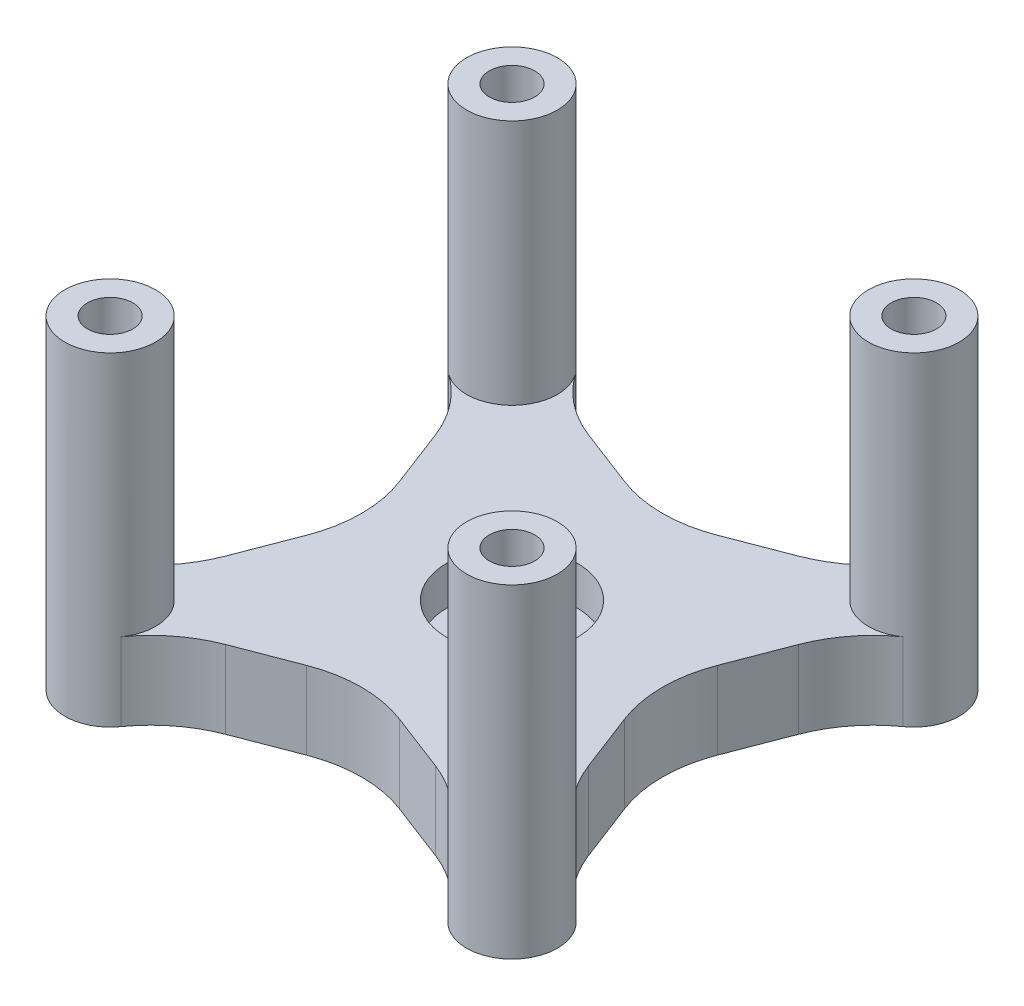
ISO-10303-21;
HEADER;
FILE_DESCRIPTION(('STEP AP214'),'2;1');
FILE_NAME('part.step','',(''),(''),'','','');
FILE_SCHEMA(('AUTOMOTIVE_DESIGN { 1 0 10303 214 1 1 1 1 }'));
ENDSEC;
DATA;
#1=APPLICATION_CONTEXT('core data for automotive mechanical design processes');
#2=APPLICATION_PROTOCOL_DEFINITION('international standard','automotive_design',2000,#1);
#3=PRODUCT_CONTEXT('',#1,'mechanical');
#4=PRODUCT('Part','Part','',(#3));
#5=PRODUCT_RELATED_PRODUCT_CATEGORY('part','',(#4));
#6=PRODUCT_DEFINITION_FORMATION('','',#4);
#7=PRODUCT_DEFINITION_CONTEXT('part definition',#1,'design');
#8=PRODUCT_DEFINITION('design','',#6,#7);
#9=PRODUCT_DEFINITION_SHAPE('','',#8);
#10=(LENGTH_UNIT() NAMED_UNIT(*) SI_UNIT(.MILLI.,.METRE.));
#11=(NAMED_UNIT(*) PLANE_ANGLE_UNIT() SI_UNIT($,.RADIAN.));
#12=(NAMED_UNIT(*) SI_UNIT($,.STERADIAN.) SOLID_ANGLE_UNIT());
#13=UNCERTAINTY_MEASURE_WITH_UNIT(LENGTH_MEASURE(1.E-05),#10,'distance_accuracy_value','');
#14=(GEOMETRIC_REPRESENTATION_CONTEXT(3) GLOBAL_UNCERTAINTY_ASSIGNED_CONTEXT((#13)) GLOBAL_UNIT_ASSIGNED_CONTEXT((#10,
#11,#12)) REPRESENTATION_CONTEXT('',''));
#15=CARTESIAN_POINT('',(0.,0.,0.));
#16=DIRECTION('',(0.,0.,1.));
#17=DIRECTION('',(1.,0.,0.));
#18=AXIS2_PLACEMENT_3D('',#15,#16,#17);
#19=CARTESIAN_POINT('',(-15.5,25.,15.5));
#20=DIRECTION('',(0.,-1.,0.));
#21=DIRECTION('',(0.,0.,-1.));
#22=AXIS2_PLACEMENT_3D('',#19,#20,#21);
#23=CYLINDRICAL_SURFACE('',#22,3.5);
#24=CARTESIAN_POINT('',(-15.5,25.,15.5));
#25=DIRECTION('',(0.,1.,0.));
#26=DIRECTION('',(0.,0.,1.));
#27=AXIS2_PLACEMENT_3D('',#24,#25,#26);
#28=CIRCLE('',#27,3.5);
#29=CARTESIAN_POINT('',(-15.5,25.,19.));
#30=VERTEX_POINT('',#29);
#31=EDGE_CURVE('E263',#30,#30,#28,.T.);
#32=ORIENTED_EDGE('',*,*,#31,.F.);
#33=EDGE_LOOP('',(#32));
#34=FACE_BOUND('',#33,.T.);
#35=CARTESIAN_POINT('',(-15.5,6.,15.5));
#36=DIRECTION('',(0.,1.,0.));
#37=DIRECTION('',(0.,0.,1.));
#38=AXIS2_PLACEMENT_3D('',#35,#36,#37);
#39=CIRCLE('',#38,3.5);
#40=CARTESIAN_POINT('',(-12.6502593340276,6.,17.5319887147086));
#41=VERTEX_POINT('',#40);
#42=CARTESIAN_POINT('',(-17.5319887147086,6.,12.6502593340276));
#43=VERTEX_POINT('',#42);
#44=EDGE_CURVE('E251',#41,#43,#39,.T.);
#45=ORIENTED_EDGE('',*,*,#44,.T.);
#46=DIRECTION('',(0.,-1.,0.));
#47=VECTOR('',#46,1.);
#48=CARTESIAN_POINT('',(-17.5319887147086,25.,12.6502593340276));
#49=LINE('',#48,#47);
#50=CARTESIAN_POINT('',(-17.5319887147086,0.,12.6502593340276));
#51=VERTEX_POINT('',#50);
#52=EDGE_CURVE('E238',#43,#51,#49,.T.);
#53=ORIENTED_EDGE('',*,*,#52,.T.);
#54=CARTESIAN_POINT('',(-15.5,0.,15.5));
#55=DIRECTION('',(0.,1.,0.));
#56=DIRECTION('',(0.,0.,1.));
#57=AXIS2_PLACEMENT_3D('',#54,#55,#56);
#58=CIRCLE('',#57,3.5);
#59=CARTESIAN_POINT('',(-12.6502593340276,0.,17.5319887147086));
#60=VERTEX_POINT('',#59);
#61=EDGE_CURVE('E249',#51,#60,#58,.T.);
#62=ORIENTED_EDGE('',*,*,#61,.T.);
#63=DIRECTION('',(0.,-1.,0.));
#64=VECTOR('',#63,1.);
#65=CARTESIAN_POINT('',(-12.6502593340276,25.,17.5319887147086));
#66=LINE('',#65,#64);
#67=EDGE_CURVE('E254',#60,#41,#66,.F.);
#68=ORIENTED_EDGE('',*,*,#67,.T.);
#69=EDGE_LOOP('',(#45,#53,#62,#68));
#70=FACE_BOUND('',#69,.T.);
#71=ADVANCED_FACE('F74',(#34,#70),#23,.T.);
#72=CARTESIAN_POINT('',(0.,3.,0.));
#73=DIRECTION('',(0.,1.,0.));
#74=DIRECTION('',(0.,0.,1.));
#75=AXIS2_PLACEMENT_3D('',#72,#73,#74);
#76=PLANE('',#75);
#77=CARTESIAN_POINT('',(0.,3.,0.));
#78=DIRECTION('',(0.,1.,0.));
#79=DIRECTION('',(0.,0.,1.));
#80=AXIS2_PLACEMENT_3D('',#77,#78,#79);
#81=CIRCLE('',#80,3.);
#82=CARTESIAN_POINT('',(0.,3.,3.));
#83=VERTEX_POINT('',#82);
#84=EDGE_CURVE('E266',#83,#83,#81,.T.);
#85=ORIENTED_EDGE('',*,*,#84,.F.);
#86=EDGE_LOOP('',(#85));
#87=FACE_BOUND('',#86,.T.);
#88=CARTESIAN_POINT('',(0.,3.,0.));
#89=DIRECTION('',(0.,1.,0.));
#90=DIRECTION('',(0.,0.,1.));
#91=AXIS2_PLACEMENT_3D('',#88,#89,#90);
#92=CIRCLE('',#91,5.);
#93=CARTESIAN_POINT('',(0.,3.,5.));
#94=VERTEX_POINT('',#93);
#95=EDGE_CURVE('E270',#94,#94,#92,.F.);
#96=ORIENTED_EDGE('',*,*,#95,.F.);
#97=EDGE_LOOP('',(#96));
#98=FACE_BOUND('',#97,.T.);
#99=ADVANCED_FACE('F429',(#87,#98),#76,.T.);
#100=CARTESIAN_POINT('',(-15.5,25.,-15.5));
#101=DIRECTION('',(0.,-1.,0.));
#102=DIRECTION('',(0.,0.,-1.));
#103=AXIS2_PLACEMENT_3D('',#100,#101,#102);
#104=CYLINDRICAL_SURFACE('',#103,3.5);
#105=CARTESIAN_POINT('',(-15.5,25.,-15.5));
#106=DIRECTION('',(0.,1.,0.));
#107=DIRECTION('',(0.,0.,1.));
#108=AXIS2_PLACEMENT_3D('',#105,#106,#107);
#109=CIRCLE('',#108,3.5);
#110=CARTESIAN_POINT('',(-15.5,25.,-12.));
#111=VERTEX_POINT('',#110);
#112=EDGE_CURVE('E395',#111,#111,#109,.T.);
#113=ORIENTED_EDGE('',*,*,#112,.F.);
#114=EDGE_LOOP('',(#113));
#115=FACE_BOUND('',#114,.T.);
#116=CARTESIAN_POINT('',(-15.5,0.,-15.5));
#117=DIRECTION('',(0.,1.,0.));
#118=DIRECTION('',(0.,0.,1.));
#119=AXIS2_PLACEMENT_3D('',#116,#117,#118);
#120=CIRCLE('',#119,3.5);
#121=CARTESIAN_POINT('',(-12.6502593340276,0.,-17.5319887147086));
#122=VERTEX_POINT('',#121);
#123=CARTESIAN_POINT('',(-17.5319887147086,0.,-12.6502593340276));
#124=VERTEX_POINT('',#123);
#125=EDGE_CURVE('E876',#122,#124,#120,.T.);
#126=ORIENTED_EDGE('',*,*,#125,.T.);
#127=DIRECTION('',(0.,-1.,0.));
#128=VECTOR('',#127,1.);
#129=CARTESIAN_POINT('',(-17.5319887147086,25.,-12.6502593340276));
#130=LINE('',#129,#128);
#131=CARTESIAN_POINT('',(-17.5319887147086,6.,-12.6502593340276));
#132=VERTEX_POINT('',#131);
#133=EDGE_CURVE('E285',#124,#132,#130,.F.);
#134=ORIENTED_EDGE('',*,*,#133,.T.);
#135=CARTESIAN_POINT('',(-15.5,6.,-15.5));
#136=DIRECTION('',(0.,1.,0.));
#137=DIRECTION('',(0.,0.,1.));
#138=AXIS2_PLACEMENT_3D('',#135,#136,#137);
#139=CIRCLE('',#138,3.5);
#140=CARTESIAN_POINT('',(-12.6502593340276,6.,-17.5319887147086));
#141=VERTEX_POINT('',#140);
#142=EDGE_CURVE('E859',#132,#141,#139,.T.);
#143=ORIENTED_EDGE('',*,*,#142,.T.);
#144=DIRECTION('',(0.,-1.,0.));
#145=VECTOR('',#144,1.);
#146=CARTESIAN_POINT('',(-12.6502593340276,25.,-17.5319887147086));
#147=LINE('',#146,#145);
#148=EDGE_CURVE('E282',#141,#122,#147,.T.);
#149=ORIENTED_EDGE('',*,*,#148,.T.);
#150=EDGE_LOOP('',(#126,#134,#143,#149));
#151=FACE_BOUND('',#150,.T.);
#152=ADVANCED_FACE('F434',(#115,#151),#104,.T.);
#153=CARTESIAN_POINT('',(15.5,25.,-15.5));
#154=DIRECTION('',(0.,-1.,0.));
#155=DIRECTION('',(0.,0.,-1.));
#156=AXIS2_PLACEMENT_3D('',#153,#154,#155);
#157=CYLINDRICAL_SURFACE('',#156,3.5);
#158=CARTESIAN_POINT('',(15.5,25.,-15.5));
#159=DIRECTION('',(0.,1.,0.));
#160=DIRECTION('',(0.,0.,1.));
#161=AXIS2_PLACEMENT_3D('',#158,#159,#160);
#162=CIRCLE('',#161,3.5);
#163=CARTESIAN_POINT('',(15.5,25.,-12.));
#164=VERTEX_POINT('',#163);
#165=EDGE_CURVE('E868',#164,#164,#162,.T.);
#166=ORIENTED_EDGE('',*,*,#165,.F.);
#167=EDGE_LOOP('',(#166));
#168=FACE_BOUND('',#167,.T.);
#169=CARTESIAN_POINT('',(15.5,0.,-15.5));
#170=DIRECTION('',(0.,1.,0.));
#171=DIRECTION('',(0.,0.,1.));
#172=AXIS2_PLACEMENT_3D('',#169,#170,#171);
#173=CIRCLE('',#172,3.5);
#174=CARTESIAN_POINT('',(17.5319887147087,0.,-12.6502593340276));
#175=VERTEX_POINT('',#174);
#176=CARTESIAN_POINT('',(12.6502593340276,0.,-17.5319887147086));
#177=VERTEX_POINT('',#176);
#178=EDGE_CURVE('E869',#175,#177,#173,.T.);
#179=ORIENTED_EDGE('',*,*,#178,.T.);
#180=DIRECTION('',(0.,-1.,0.));
#181=VECTOR('',#180,1.);
#182=CARTESIAN_POINT('',(12.6502593340276,25.,-17.5319887147086));
#183=LINE('',#182,#181);
#184=CARTESIAN_POINT('',(12.6502593340276,6.,-17.5319887147086));
#185=VERTEX_POINT('',#184);
#186=EDGE_CURVE('E301',#177,#185,#183,.F.);
#187=ORIENTED_EDGE('',*,*,#186,.T.);
#188=CARTESIAN_POINT('',(15.5,6.,-15.5));
#189=DIRECTION('',(0.,1.,0.));
#190=DIRECTION('',(0.,0.,1.));
#191=AXIS2_PLACEMENT_3D('',#188,#189,#190);
#192=CIRCLE('',#191,3.5);
#193=CARTESIAN_POINT('',(17.5319887147087,6.,-12.6502593340276));
#194=VERTEX_POINT('',#193);
#195=EDGE_CURVE('E907',#185,#194,#192,.T.);
#196=ORIENTED_EDGE('',*,*,#195,.T.);
#197=DIRECTION('',(0.,-1.,0.));
#198=VECTOR('',#197,1.);
#199=CARTESIAN_POINT('',(17.5319887147087,25.,-12.6502593340276));
#200=LINE('',#199,#198);
#201=EDGE_CURVE('E298',#194,#175,#200,.T.);
#202=ORIENTED_EDGE('',*,*,#201,.T.);
#203=EDGE_LOOP('',(#179,#187,#196,#202));
#204=FACE_BOUND('',#203,.T.);
#205=ADVANCED_FACE('F443',(#168,#204),#157,.T.);
#206=CARTESIAN_POINT('',(-15.5,25.,15.5));
#207=DIRECTION('',(0.,-1.,0.));
#208=DIRECTION('',(0.,0.,-1.));
#209=AXIS2_PLACEMENT_3D('',#206,#207,#208);
#210=CYLINDRICAL_SURFACE('',#209,1.75);
#211=CARTESIAN_POINT('',(-15.5,25.,15.5));
#212=DIRECTION('',(0.,1.,0.));
#213=DIRECTION('',(0.,0.,1.));
#214=AXIS2_PLACEMENT_3D('',#211,#212,#213);
#215=CIRCLE('',#214,1.75);
#216=CARTESIAN_POINT('',(-15.5,25.,17.25));
#217=VERTEX_POINT('',#216);
#218=EDGE_CURVE('E259',#217,#217,#215,.T.);
#219=ORIENTED_EDGE('',*,*,#218,.T.);
#220=EDGE_LOOP('',(#219));
#221=FACE_BOUND('',#220,.T.);
#222=CARTESIAN_POINT('',(-15.5,0.,15.5));
#223=DIRECTION('',(0.,1.,0.));
#224=DIRECTION('',(0.,0.,1.));
#225=AXIS2_PLACEMENT_3D('',#222,#223,#224);
#226=CIRCLE('',#225,1.75);
#227=CARTESIAN_POINT('',(-15.5,0.,17.25));
#228=VERTEX_POINT('',#227);
#229=EDGE_CURVE('E260',#228,#228,#226,.T.);
#230=ORIENTED_EDGE('',*,*,#229,.F.);
#231=EDGE_LOOP('',(#230));
#232=FACE_BOUND('',#231,.T.);
#233=ADVANCED_FACE('F440',(#221,#232),#210,.F.);
#234=CARTESIAN_POINT('',(0.,25.,0.));
#235=DIRECTION('',(0.,1.,0.));
#236=DIRECTION('',(0.,0.,1.));
#237=AXIS2_PLACEMENT_3D('',#234,#235,#236);
#238=PLANE('',#237);
#239=ORIENTED_EDGE('',*,*,#218,.F.);
#240=EDGE_LOOP('',(#239));
#241=FACE_BOUND('',#240,.T.);
#242=ORIENTED_EDGE('',*,*,#31,.T.);
#243=EDGE_LOOP('',(#242));
#244=FACE_BOUND('',#243,.T.);
#245=ADVANCED_FACE('F426',(#241,#244),#238,.T.);
#246=CARTESIAN_POINT('',(0.,0.,0.));
#247=DIRECTION('',(0.,1.,0.));
#248=DIRECTION('',(0.,0.,1.));
#249=AXIS2_PLACEMENT_3D('',#246,#247,#248);
#250=PLANE('',#249);
#251=ORIENTED_EDGE('',*,*,#229,.T.);
#252=EDGE_LOOP('',(#251));
#253=FACE_BOUND('',#252,.T.);
#254=ORIENTED_EDGE('',*,*,#61,.F.);
#255=CARTESIAN_POINT('',(-23.3376707567334,0.,4.50814314553511));
#256=DIRECTION('',(0.,1.,0.));
#257=DIRECTION('',(0.,0.,1.));
#258=AXIS2_PLACEMENT_3D('',#255,#256,#257);
#259=CIRCLE('',#258,10.);
#260=CARTESIAN_POINT('',(-14.0002095837129,0.,8.08750326185964));
#261=VERTEX_POINT('',#260);
#262=EDGE_CURVE('E234',#51,#261,#259,.T.);
#263=ORIENTED_EDGE('',*,*,#262,.T.);
#264=DIRECTION('',(0.357936011632452,0.,-0.93374611730205));
#265=VECTOR('',#264,1.);
#266=CARTESIAN_POINT('',(-9.50351174618551,0.,-3.64301283603778));
#267=LINE('',#266,#265);
#268=CARTESIAN_POINT('',(-12.2720880445911,0.,3.57936011632452));
#269=VERTEX_POINT('',#268);
#270=EDGE_CURVE('E419',#261,#269,#267,.T.);
#271=ORIENTED_EDGE('',*,*,#270,.T.);
#272=CARTESIAN_POINT('',(-21.6095492176116,0.,0.));
#273=DIRECTION('',(0.,1.,0.));
#274=DIRECTION('',(0.,0.,1.));
#275=AXIS2_PLACEMENT_3D('',#272,#273,#274);
#276=CIRCLE('',#275,10.);
#277=CARTESIAN_POINT('',(-12.2720880445911,0.,-3.57936011632453));
#278=VERTEX_POINT('',#277);
#279=EDGE_CURVE('E330',#269,#278,#276,.T.);
#280=ORIENTED_EDGE('',*,*,#279,.T.);
#281=DIRECTION('',(-0.357936011632452,0.,-0.93374611730205));
#282=VECTOR('',#281,1.);
#283=CARTESIAN_POINT('',(-9.50351174618551,0.,3.64301283603778));
#284=LINE('',#283,#282);
#285=CARTESIAN_POINT('',(-14.0002095837129,0.,-8.08750326185964));
#286=VERTEX_POINT('',#285);
#287=EDGE_CURVE('E416',#278,#286,#284,.T.);
#288=ORIENTED_EDGE('',*,*,#287,.T.);
#289=CARTESIAN_POINT('',(-23.3376707567334,0.,-4.50814314553511));
#290=DIRECTION('',(0.,1.,0.));
#291=DIRECTION('',(0.,0.,1.));
#292=AXIS2_PLACEMENT_3D('',#289,#290,#291);
#293=CIRCLE('',#292,10.);
#294=EDGE_CURVE('E334',#286,#124,#293,.T.);
#295=ORIENTED_EDGE('',*,*,#294,.T.);
#296=ORIENTED_EDGE('',*,*,#125,.F.);
#297=CARTESIAN_POINT('',(-4.50814314553511,0.,-23.3376707567334));
#298=DIRECTION('',(0.,1.,0.));
#299=DIRECTION('',(0.,0.,1.));
#300=AXIS2_PLACEMENT_3D('',#297,#298,#299);
#301=CIRCLE('',#300,10.);
#302=CARTESIAN_POINT('',(-8.08750326185963,0.,-14.0002095837129));
#303=VERTEX_POINT('',#302);
#304=EDGE_CURVE('E338',#122,#303,#301,.T.);
#305=ORIENTED_EDGE('',*,*,#304,.T.);
#306=DIRECTION('',(0.93374611730205,0.,0.357936011632452));
#307=VECTOR('',#306,1.);
#308=CARTESIAN_POINT('',(3.64301283603778,0.,-9.50351174618552));
#309=LINE('',#308,#307);
#310=CARTESIAN_POINT('',(-3.57936011632452,0.,-12.2720880445911));
#311=VERTEX_POINT('',#310);
#312=EDGE_CURVE('E413',#303,#311,#309,.T.);
#313=ORIENTED_EDGE('',*,*,#312,.T.);
#314=CARTESIAN_POINT('',(0.,0.,-21.6095492176116));
#315=DIRECTION('',(0.,1.,0.));
#316=DIRECTION('',(0.,0.,1.));
#317=AXIS2_PLACEMENT_3D('',#314,#315,#316);
#318=CIRCLE('',#317,10.);
#319=CARTESIAN_POINT('',(3.57936011632453,0.,-12.2720880445911));
#320=VERTEX_POINT('',#319);
#321=EDGE_CURVE('E343',#311,#320,#318,.T.);
#322=ORIENTED_EDGE('',*,*,#321,.T.);
#323=DIRECTION('',(0.933746117302049,0.,-0.357936011632453));
#324=VECTOR('',#323,1.);
#325=CARTESIAN_POINT('',(-3.64301283603778,0.,-9.50351174618551));
#326=LINE('',#325,#324);
#327=CARTESIAN_POINT('',(8.08750326185963,0.,-14.0002095837129));
#328=VERTEX_POINT('',#327);
#329=EDGE_CURVE('E410',#320,#328,#326,.T.);
#330=ORIENTED_EDGE('',*,*,#329,.T.);
#331=CARTESIAN_POINT('',(4.50814314553511,0.,-23.3376707567333));
#332=DIRECTION('',(0.,1.,0.));
#333=DIRECTION('',(0.,0.,1.));
#334=AXIS2_PLACEMENT_3D('',#331,#332,#333);
#335=CIRCLE('',#334,10.);
#336=EDGE_CURVE('E347',#328,#177,#335,.T.);
#337=ORIENTED_EDGE('',*,*,#336,.T.);
#338=ORIENTED_EDGE('',*,*,#178,.F.);
#339=CARTESIAN_POINT('',(23.3376707567334,0.,-4.50814314553511));
#340=DIRECTION('',(0.,1.,0.));
#341=DIRECTION('',(0.,0.,1.));
#342=AXIS2_PLACEMENT_3D('',#339,#340,#341);
#343=CIRCLE('',#342,10.);
#344=CARTESIAN_POINT('',(14.0002095837129,0.,-8.08750326185964));
#345=VERTEX_POINT('',#344);
#346=EDGE_CURVE('E351',#175,#345,#343,.T.);
#347=ORIENTED_EDGE('',*,*,#346,.T.);
#348=DIRECTION('',(-0.357936011632452,0.,0.93374611730205));
#349=VECTOR('',#348,1.);
#350=CARTESIAN_POINT('',(9.50351174618552,0.,3.64301283603778));
#351=LINE('',#350,#349);
#352=CARTESIAN_POINT('',(12.2720880445911,0.,-3.57936011632452));
#353=VERTEX_POINT('',#352);
#354=EDGE_CURVE('E407',#345,#353,#351,.T.);
#355=ORIENTED_EDGE('',*,*,#354,.T.);
#356=CARTESIAN_POINT('',(21.6095492176116,0.,0.));
#357=DIRECTION('',(0.,1.,0.));
#358=DIRECTION('',(0.,0.,1.));
#359=AXIS2_PLACEMENT_3D('',#356,#357,#358);
#360=CIRCLE('',#359,10.);
#361=CARTESIAN_POINT('',(12.2720880445911,0.,3.57936011632453));
#362=VERTEX_POINT('',#361);
#363=EDGE_CURVE('E356',#353,#362,#360,.T.);
#364=ORIENTED_EDGE('',*,*,#363,.T.);
#365=DIRECTION('',(0.357936011632452,0.,0.93374611730205));
#366=VECTOR('',#365,1.);
#367=CARTESIAN_POINT('',(9.50351174618552,0.,-3.64301283603778));
#368=LINE('',#367,#366);
#369=CARTESIAN_POINT('',(14.0002095837129,0.,8.08750326185963));
#370=VERTEX_POINT('',#369);
#371=EDGE_CURVE('E397',#362,#370,#368,.T.);
#372=ORIENTED_EDGE('',*,*,#371,.T.);
#373=CARTESIAN_POINT('',(23.3376707567334,0.,4.50814314553511));
#374=DIRECTION('',(0.,1.,0.));
#375=DIRECTION('',(0.,0.,1.));
#376=AXIS2_PLACEMENT_3D('',#373,#374,#375);
#377=CIRCLE('',#376,10.);
#378=CARTESIAN_POINT('',(17.5319887147087,0.,12.6502593340276));
#379=VERTEX_POINT('',#378);
#380=EDGE_CURVE('E360',#370,#379,#377,.T.);
#381=ORIENTED_EDGE('',*,*,#380,.T.);
#382=CARTESIAN_POINT('',(15.5,0.,15.5));
#383=DIRECTION('',(0.,1.,0.));
#384=DIRECTION('',(0.,0.,1.));
#385=AXIS2_PLACEMENT_3D('',#382,#383,#384);
#386=CIRCLE('',#385,3.5);
#387=CARTESIAN_POINT('',(12.6502593340276,0.,17.5319887147086));
#388=VERTEX_POINT('',#387);
#389=EDGE_CURVE('E853',#388,#379,#386,.T.);
#390=ORIENTED_EDGE('',*,*,#389,.F.);
#391=CARTESIAN_POINT('',(4.50814314553513,0.,23.3376707567334));
#392=DIRECTION('',(0.,1.,0.));
#393=DIRECTION('',(0.,0.,1.));
#394=AXIS2_PLACEMENT_3D('',#391,#392,#393);
#395=CIRCLE('',#394,10.);
#396=CARTESIAN_POINT('',(8.08750326185965,0.,14.0002095837129));
#397=VERTEX_POINT('',#396);
#398=EDGE_CURVE('E364',#388,#397,#395,.T.);
#399=ORIENTED_EDGE('',*,*,#398,.T.);
#400=DIRECTION('',(0.93374611730205,0.,0.357936011632452));
#401=VECTOR('',#400,1.);
#402=CARTESIAN_POINT('',(-3.64301283603778,0.,9.50351174618551));
#403=LINE('',#402,#401);
#404=CARTESIAN_POINT('',(3.57936011632452,0.,12.2720880445911));
#405=VERTEX_POINT('',#404);
#406=EDGE_CURVE('E392',#405,#397,#403,.T.);
#407=ORIENTED_EDGE('',*,*,#406,.F.);
#408=CARTESIAN_POINT('',(0.,0.,21.6095492176116));
#409=DIRECTION('',(0.,1.,0.));
#410=DIRECTION('',(0.,0.,1.));
#411=AXIS2_PLACEMENT_3D('',#408,#409,#410);
#412=CIRCLE('',#411,10.);
#413=CARTESIAN_POINT('',(-3.57936011632452,0.,12.2720880445911));
#414=VERTEX_POINT('',#413);
#415=EDGE_CURVE('E369',#405,#414,#412,.T.);
#416=ORIENTED_EDGE('',*,*,#415,.T.);
#417=DIRECTION('',(0.93374611730205,0.,-0.357936011632452));
#418=VECTOR('',#417,1.);
#419=CARTESIAN_POINT('',(3.64301283603778,0.,9.50351174618552));
#420=LINE('',#419,#418);
#421=CARTESIAN_POINT('',(-8.08750326185963,0.,14.0002095837129));
#422=VERTEX_POINT('',#421);
#423=EDGE_CURVE('E391',#422,#414,#420,.T.);
#424=ORIENTED_EDGE('',*,*,#423,.F.);
#425=CARTESIAN_POINT('',(-4.50814314553511,0.,23.3376707567334));
#426=DIRECTION('',(0.,1.,0.));
#427=DIRECTION('',(0.,0.,1.));
#428=AXIS2_PLACEMENT_3D('',#425,#426,#427);
#429=CIRCLE('',#428,10.);
#430=EDGE_CURVE('E82',#422,#60,#429,.T.);
#431=ORIENTED_EDGE('',*,*,#430,.T.);
#432=EDGE_LOOP('',(#254,#263,#271,#280,#288,#295,#296,#305,#313,#322,#330,#337,#338,#347,#355,
#364,#372,#381,#390,#399,#407,#416,#424,#431));
#433=FACE_BOUND('',#432,.T.);
#434=CARTESIAN_POINT('',(0.,0.,0.));
#435=DIRECTION('',(0.,1.,0.));
#436=DIRECTION('',(0.,0.,1.));
#437=AXIS2_PLACEMENT_3D('',#434,#435,#436);
#438=CIRCLE('',#437,3.);
#439=CARTESIAN_POINT('',(0.,0.,3.));
#440=VERTEX_POINT('',#439);
#441=EDGE_CURVE('E421',#440,#440,#438,.T.);
#442=ORIENTED_EDGE('',*,*,#441,.T.);
#443=EDGE_LOOP('',(#442));
#444=FACE_BOUND('',#443,.T.);
#445=CARTESIAN_POINT('',(-15.5,0.,-15.5));
#446=DIRECTION('',(0.,1.,0.));
#447=DIRECTION('',(0.,0.,1.));
#448=AXIS2_PLACEMENT_3D('',#445,#446,#447);
#449=CIRCLE('',#448,1.75);
#450=CARTESIAN_POINT('',(-15.5,0.,-13.75));
#451=VERTEX_POINT('',#450);
#452=EDGE_CURVE('E844',#451,#451,#449,.T.);
#453=ORIENTED_EDGE('',*,*,#452,.T.);
#454=EDGE_LOOP('',(#453));
#455=FACE_BOUND('',#454,.T.);
#456=CARTESIAN_POINT('',(15.5,0.,-15.5));
#457=DIRECTION('',(0.,1.,0.));
#458=DIRECTION('',(0.,0.,1.));
#459=AXIS2_PLACEMENT_3D('',#456,#457,#458);
#460=CIRCLE('',#459,1.75);
#461=CARTESIAN_POINT('',(15.5,0.,-13.75));
#462=VERTEX_POINT('',#461);
#463=EDGE_CURVE('E848',#462,#462,#460,.T.);
#464=ORIENTED_EDGE('',*,*,#463,.T.);
#465=EDGE_LOOP('',(#464));
#466=FACE_BOUND('',#465,.T.);
#467=CARTESIAN_POINT('',(15.5,0.,15.5));
#468=DIRECTION('',(0.,1.,0.));
#469=DIRECTION('',(0.,0.,1.));
#470=AXIS2_PLACEMENT_3D('',#467,#468,#469);
#471=CIRCLE('',#470,1.75);
#472=CARTESIAN_POINT('',(15.5,0.,17.25));
#473=VERTEX_POINT('',#472);
#474=EDGE_CURVE('E851',#473,#473,#471,.T.);
#475=ORIENTED_EDGE('',*,*,#474,.T.);
#476=EDGE_LOOP('',(#475));
#477=FACE_BOUND('',#476,.T.);
#478=ADVANCED_FACE('F256',(#253,#433,#444,#455,#466,#477),#250,.F.);
#479=CARTESIAN_POINT('',(3.64301283603778,3.,9.50351174618552));
#480=DIRECTION('',(-0.357936011632452,0.,-0.93374611730205));
#481=DIRECTION('',(-0.93374611730205,0.,0.357936011632452));
#482=AXIS2_PLACEMENT_3D('',#479,#480,#481);
#483=PLANE('',#482);
#484=ORIENTED_EDGE('',*,*,#423,.T.);
#485=DIRECTION('',(0.,-1.,0.));
#486=VECTOR('',#485,1.);
#487=CARTESIAN_POINT('',(-3.57936011632452,6.,12.2720880445911));
#488=LINE('',#487,#486);
#489=CARTESIAN_POINT('',(-3.57936011632452,6.,12.2720880445911));
#490=VERTEX_POINT('',#489);
#491=EDGE_CURVE('E94',#414,#490,#488,.F.);
#492=ORIENTED_EDGE('',*,*,#491,.T.);
#493=DIRECTION('',(-0.93374611730205,0.,0.357936011632452));
#494=VECTOR('',#493,1.);
#495=CARTESIAN_POINT('',(3.64301283603778,6.,9.50351174618552));
#496=LINE('',#495,#494);
#497=CARTESIAN_POINT('',(-8.08750326185963,6.,14.0002095837129));
#498=VERTEX_POINT('',#497);
#499=EDGE_CURVE('E380',#490,#498,#496,.T.);
#500=ORIENTED_EDGE('',*,*,#499,.T.);
#501=DIRECTION('',(0.,1.,0.));
#502=VECTOR('',#501,1.);
#503=CARTESIAN_POINT('',(-8.08750326185963,0.,14.0002095837129));
#504=LINE('',#503,#502);
#505=EDGE_CURVE('E325',#498,#422,#504,.F.);
#506=ORIENTED_EDGE('',*,*,#505,.T.);
#507=EDGE_LOOP('',(#484,#492,#500,#506));
#508=FACE_BOUND('',#507,.T.);
#509=ADVANCED_FACE('F393',(#508),#483,.F.);
#510=CARTESIAN_POINT('',(-3.64301283603778,3.,9.50351174618551));
#511=DIRECTION('',(0.357936011632452,0.,-0.93374611730205));
#512=DIRECTION('',(-0.93374611730205,0.,-0.357936011632452));
#513=AXIS2_PLACEMENT_3D('',#510,#511,#512);
#514=PLANE('',#513);
#515=ORIENTED_EDGE('',*,*,#406,.T.);
#516=DIRECTION('',(0.,1.,0.));
#517=VECTOR('',#516,1.);
#518=CARTESIAN_POINT('',(8.08750326185965,6.,14.0002095837129));
#519=LINE('',#518,#517);
#520=CARTESIAN_POINT('',(8.08750326185965,6.,14.0002095837129));
#521=VERTEX_POINT('',#520);
#522=EDGE_CURVE('E323',#397,#521,#519,.T.);
#523=ORIENTED_EDGE('',*,*,#522,.T.);
#524=DIRECTION('',(-0.93374611730205,0.,-0.357936011632452));
#525=VECTOR('',#524,1.);
#526=CARTESIAN_POINT('',(-3.64301283603778,6.,9.50351174618551));
#527=LINE('',#526,#525);
#528=CARTESIAN_POINT('',(3.57936011632452,6.,12.2720880445911));
#529=VERTEX_POINT('',#528);
#530=EDGE_CURVE('E378',#521,#529,#527,.T.);
#531=ORIENTED_EDGE('',*,*,#530,.T.);
#532=DIRECTION('',(0.,-1.,0.));
#533=VECTOR('',#532,1.);
#534=CARTESIAN_POINT('',(3.57936011632453,0.,12.2720880445911));
#535=LINE('',#534,#533);
#536=EDGE_CURVE('E320',#529,#405,#535,.T.);
#537=ORIENTED_EDGE('',*,*,#536,.T.);
#538=EDGE_LOOP('',(#515,#523,#531,#537));
#539=FACE_BOUND('',#538,.T.);
#540=ADVANCED_FACE('F385',(#539),#514,.F.);
#541=CARTESIAN_POINT('',(9.50351174618552,3.,-3.64301283603778));
#542=DIRECTION('',(0.93374611730205,0.,-0.357936011632452));
#543=DIRECTION('',(-0.357936011632452,0.,-0.93374611730205));
#544=AXIS2_PLACEMENT_3D('',#541,#542,#543);
#545=PLANE('',#544);
#546=ORIENTED_EDGE('',*,*,#371,.F.);
#547=DIRECTION('',(0.,-1.,0.));
#548=VECTOR('',#547,1.);
#549=CARTESIAN_POINT('',(12.2720880445911,6.,3.57936011632453));
#550=LINE('',#549,#548);
#551=CARTESIAN_POINT('',(12.2720880445911,6.,3.57936011632453));
#552=VERTEX_POINT('',#551);
#553=EDGE_CURVE('E312',#362,#552,#550,.F.);
#554=ORIENTED_EDGE('',*,*,#553,.T.);
#555=DIRECTION('',(-0.357936011632452,0.,-0.93374611730205));
#556=VECTOR('',#555,1.);
#557=CARTESIAN_POINT('',(9.50351174618552,6.,-3.64301283603778));
#558=LINE('',#557,#556);
#559=CARTESIAN_POINT('',(14.0002095837129,6.,8.08750326185963));
#560=VERTEX_POINT('',#559);
#561=EDGE_CURVE('E901',#560,#552,#558,.T.);
#562=ORIENTED_EDGE('',*,*,#561,.F.);
#563=DIRECTION('',(0.,-1.,0.));
#564=VECTOR('',#563,1.);
#565=CARTESIAN_POINT('',(14.0002095837129,3.,8.08750326185963));
#566=LINE('',#565,#564);
#567=EDGE_CURVE('E309',#560,#370,#566,.T.);
#568=ORIENTED_EDGE('',*,*,#567,.T.);
#569=EDGE_LOOP('',(#546,#554,#562,#568));
#570=FACE_BOUND('',#569,.T.);
#571=ADVANCED_FACE('F640',(#570),#545,.T.);
#572=CARTESIAN_POINT('',(9.50351174618552,3.,3.64301283603778));
#573=DIRECTION('',(0.93374611730205,0.,0.357936011632452));
#574=DIRECTION('',(0.357936011632452,0.,-0.93374611730205));
#575=AXIS2_PLACEMENT_3D('',#572,#573,#574);
#576=PLANE('',#575);
#577=ORIENTED_EDGE('',*,*,#354,.F.);
#578=DIRECTION('',(0.,-1.,0.));
#579=VECTOR('',#578,1.);
#580=CARTESIAN_POINT('',(14.0002095837129,3.,-8.08750326185964));
#581=LINE('',#580,#579);
#582=CARTESIAN_POINT('',(14.0002095837129,6.,-8.08750326185964));
#583=VERTEX_POINT('',#582);
#584=EDGE_CURVE('E307',#345,#583,#581,.F.);
#585=ORIENTED_EDGE('',*,*,#584,.T.);
#586=DIRECTION('',(0.357936011632452,0.,-0.93374611730205));
#587=VECTOR('',#586,1.);
#588=CARTESIAN_POINT('',(9.50351174618552,6.,3.64301283603778));
#589=LINE('',#588,#587);
#590=CARTESIAN_POINT('',(12.2720880445911,6.,-3.57936011632452));
#591=VERTEX_POINT('',#590);
#592=EDGE_CURVE('E904',#591,#583,#589,.T.);
#593=ORIENTED_EDGE('',*,*,#592,.F.);
#594=DIRECTION('',(0.,-1.,0.));
#595=VECTOR('',#594,1.);
#596=CARTESIAN_POINT('',(12.2720880445911,0.,-3.57936011632452));
#597=LINE('',#596,#595);
#598=EDGE_CURVE('E304',#591,#353,#597,.T.);
#599=ORIENTED_EDGE('',*,*,#598,.T.);
#600=EDGE_LOOP('',(#577,#585,#593,#599));
#601=FACE_BOUND('',#600,.T.);
#602=ADVANCED_FACE('F629',(#601),#576,.T.);
#603=CARTESIAN_POINT('',(-3.64301283603778,3.,-9.50351174618551));
#604=DIRECTION('',(-0.357936011632453,0.,-0.933746117302049));
#605=DIRECTION('',(-0.933746117302049,0.,0.357936011632453));
#606=AXIS2_PLACEMENT_3D('',#603,#604,#605);
#607=PLANE('',#606);
#608=ORIENTED_EDGE('',*,*,#329,.F.);
#609=DIRECTION('',(0.,-1.,0.));
#610=VECTOR('',#609,1.);
#611=CARTESIAN_POINT('',(3.57936011632453,6.,-12.2720880445911));
#612=LINE('',#611,#610);
#613=CARTESIAN_POINT('',(3.57936011632453,6.,-12.2720880445911));
#614=VERTEX_POINT('',#613);
#615=EDGE_CURVE('E296',#320,#614,#612,.F.);
#616=ORIENTED_EDGE('',*,*,#615,.T.);
#617=DIRECTION('',(-0.933746117302049,0.,0.357936011632452));
#618=VECTOR('',#617,1.);
#619=CARTESIAN_POINT('',(-3.64301283603778,6.,-9.50351174618551));
#620=LINE('',#619,#618);
#621=CARTESIAN_POINT('',(8.08750326185963,6.,-14.0002095837129));
#622=VERTEX_POINT('',#621);
#623=EDGE_CURVE('E909',#622,#614,#620,.T.);
#624=ORIENTED_EDGE('',*,*,#623,.F.);
#625=DIRECTION('',(0.,-1.,0.));
#626=VECTOR('',#625,1.);
#627=CARTESIAN_POINT('',(8.08750326185963,3.,-14.0002095837129));
#628=LINE('',#627,#626);
#629=EDGE_CURVE('E293',#622,#328,#628,.T.);
#630=ORIENTED_EDGE('',*,*,#629,.T.);
#631=EDGE_LOOP('',(#608,#616,#624,#630));
#632=FACE_BOUND('',#631,.T.);
#633=ADVANCED_FACE('F618',(#632),#607,.T.);
#634=CARTESIAN_POINT('',(3.64301283603778,3.,-9.50351174618552));
#635=DIRECTION('',(0.357936011632452,0.,-0.93374611730205));
#636=DIRECTION('',(-0.93374611730205,0.,-0.357936011632452));
#637=AXIS2_PLACEMENT_3D('',#634,#635,#636);
#638=PLANE('',#637);
#639=ORIENTED_EDGE('',*,*,#312,.F.);
#640=DIRECTION('',(0.,-1.,0.));
#641=VECTOR('',#640,1.);
#642=CARTESIAN_POINT('',(-8.08750326185963,3.,-14.0002095837129));
#643=LINE('',#642,#641);
#644=CARTESIAN_POINT('',(-8.08750326185963,6.,-14.0002095837129));
#645=VERTEX_POINT('',#644);
#646=EDGE_CURVE('E291',#303,#645,#643,.F.);
#647=ORIENTED_EDGE('',*,*,#646,.T.);
#648=DIRECTION('',(-0.93374611730205,0.,-0.357936011632452));
#649=VECTOR('',#648,1.);
#650=CARTESIAN_POINT('',(3.64301283603778,6.,-9.50351174618552));
#651=LINE('',#650,#649);
#652=CARTESIAN_POINT('',(-3.57936011632451,6.,-12.2720880445911));
#653=VERTEX_POINT('',#652);
#654=EDGE_CURVE('E912',#653,#645,#651,.T.);
#655=ORIENTED_EDGE('',*,*,#654,.F.);
#656=DIRECTION('',(0.,-1.,0.));
#657=VECTOR('',#656,1.);
#658=CARTESIAN_POINT('',(-3.57936011632451,0.,-12.2720880445911));
#659=LINE('',#658,#657);
#660=EDGE_CURVE('E288',#653,#311,#659,.T.);
#661=ORIENTED_EDGE('',*,*,#660,.T.);
#662=EDGE_LOOP('',(#639,#647,#655,#661));
#663=FACE_BOUND('',#662,.T.);
#664=ADVANCED_FACE('F607',(#663),#638,.T.);
#665=CARTESIAN_POINT('',(-9.50351174618551,3.,3.64301283603778));
#666=DIRECTION('',(-0.93374611730205,0.,0.357936011632452));
#667=DIRECTION('',(0.357936011632452,0.,0.93374611730205));
#668=AXIS2_PLACEMENT_3D('',#665,#666,#667);
#669=PLANE('',#668);
#670=ORIENTED_EDGE('',*,*,#287,.F.);
#671=DIRECTION('',(0.,-1.,0.));
#672=VECTOR('',#671,1.);
#673=CARTESIAN_POINT('',(-12.2720880445911,6.,-3.57936011632452));
#674=LINE('',#673,#672);
#675=CARTESIAN_POINT('',(-12.2720880445911,6.,-3.57936011632453));
#676=VERTEX_POINT('',#675);
#677=EDGE_CURVE('E280',#278,#676,#674,.F.);
#678=ORIENTED_EDGE('',*,*,#677,.T.);
#679=DIRECTION('',(0.357936011632452,0.,0.93374611730205));
#680=VECTOR('',#679,1.);
#681=CARTESIAN_POINT('',(-9.50351174618551,6.,3.64301283603778));
#682=LINE('',#681,#680);
#683=CARTESIAN_POINT('',(-14.0002095837129,6.,-8.08750326185963));
#684=VERTEX_POINT('',#683);
#685=EDGE_CURVE('E854',#684,#676,#682,.T.);
#686=ORIENTED_EDGE('',*,*,#685,.F.);
#687=DIRECTION('',(0.,-1.,0.));
#688=VECTOR('',#687,1.);
#689=CARTESIAN_POINT('',(-14.0002095837129,3.,-8.08750326185963));
#690=LINE('',#689,#688);
#691=EDGE_CURVE('E277',#684,#286,#690,.T.);
#692=ORIENTED_EDGE('',*,*,#691,.T.);
#693=EDGE_LOOP('',(#670,#678,#686,#692));
#694=FACE_BOUND('',#693,.T.);
#695=ADVANCED_FACE('F594',(#694),#669,.T.);
#696=CARTESIAN_POINT('',(-9.50351174618551,3.,-3.64301283603778));
#697=DIRECTION('',(-0.93374611730205,0.,-0.357936011632452));
#698=DIRECTION('',(-0.357936011632452,0.,0.93374611730205));
#699=AXIS2_PLACEMENT_3D('',#696,#697,#698);
#700=PLANE('',#699);
#701=ORIENTED_EDGE('',*,*,#270,.F.);
#702=DIRECTION('',(0.,-1.,0.));
#703=VECTOR('',#702,1.);
#704=CARTESIAN_POINT('',(-14.0002095837129,3.,8.08750326185964));
#705=LINE('',#704,#703);
#706=CARTESIAN_POINT('',(-14.0002095837129,6.,8.08750326185964));
#707=VERTEX_POINT('',#706);
#708=EDGE_CURVE('E239',#261,#707,#705,.F.);
#709=ORIENTED_EDGE('',*,*,#708,.T.);
#710=DIRECTION('',(-0.357936011632452,0.,0.93374611730205));
#711=VECTOR('',#710,1.);
#712=CARTESIAN_POINT('',(-9.50351174618551,6.,-3.64301283603778));
#713=LINE('',#712,#711);
#714=CARTESIAN_POINT('',(-12.2720880445911,6.,3.57936011632453));
#715=VERTEX_POINT('',#714);
#716=EDGE_CURVE('E892',#715,#707,#713,.T.);
#717=ORIENTED_EDGE('',*,*,#716,.F.);
#718=DIRECTION('',(0.,-1.,0.));
#719=VECTOR('',#718,1.);
#720=CARTESIAN_POINT('',(-12.2720880445911,0.,3.57936011632452));
#721=LINE('',#720,#719);
#722=EDGE_CURVE('E253',#715,#269,#721,.T.);
#723=ORIENTED_EDGE('',*,*,#722,.T.);
#724=EDGE_LOOP('',(#701,#709,#717,#723));
#725=FACE_BOUND('',#724,.T.);
#726=ADVANCED_FACE('F588',(#725),#700,.T.);
#727=CARTESIAN_POINT('',(0.,3.,0.));
#728=DIRECTION('',(0.,-1.,0.));
#729=DIRECTION('',(0.,0.,-1.));
#730=AXIS2_PLACEMENT_3D('',#727,#728,#729);
#731=CYLINDRICAL_SURFACE('',#730,3.);
#732=ORIENTED_EDGE('',*,*,#84,.T.);
#733=EDGE_LOOP('',(#732));
#734=FACE_BOUND('',#733,.T.);
#735=ORIENTED_EDGE('',*,*,#441,.F.);
#736=EDGE_LOOP('',(#735));
#737=FACE_BOUND('',#736,.T.);
#738=ADVANCED_FACE('F593',(#734,#737),#731,.F.);
#739=CARTESIAN_POINT('',(-15.5,25.,-15.5));
#740=DIRECTION('',(0.,-1.,0.));
#741=DIRECTION('',(0.,0.,-1.));
#742=AXIS2_PLACEMENT_3D('',#739,#740,#741);
#743=CYLINDRICAL_SURFACE('',#742,1.75);
#744=CARTESIAN_POINT('',(-15.5,25.,-15.5));
#745=DIRECTION('',(0.,1.,0.));
#746=DIRECTION('',(0.,0.,1.));
#747=AXIS2_PLACEMENT_3D('',#744,#745,#746);
#748=CIRCLE('',#747,1.75);
#749=CARTESIAN_POINT('',(-15.5,25.,-13.75));
#750=VERTEX_POINT('',#749);
#751=EDGE_CURVE('E400',#750,#750,#748,.T.);
#752=ORIENTED_EDGE('',*,*,#751,.T.);
#753=EDGE_LOOP('',(#752));
#754=FACE_BOUND('',#753,.T.);
#755=ORIENTED_EDGE('',*,*,#452,.F.);
#756=EDGE_LOOP('',(#755));
#757=FACE_BOUND('',#756,.T.);
#758=ADVANCED_FACE('F763',(#754,#757),#743,.F.);
#759=CARTESIAN_POINT('',(0.,25.,0.));
#760=DIRECTION('',(0.,1.,0.));
#761=DIRECTION('',(0.,0.,1.));
#762=AXIS2_PLACEMENT_3D('',#759,#760,#761);
#763=PLANE('',#762);
#764=ORIENTED_EDGE('',*,*,#751,.F.);
#765=EDGE_LOOP('',(#764));
#766=FACE_BOUND('',#765,.T.);
#767=ORIENTED_EDGE('',*,*,#112,.T.);
#768=EDGE_LOOP('',(#767));
#769=FACE_BOUND('',#768,.T.);
#770=ADVANCED_FACE('F752',(#766,#769),#763,.T.);
#771=CARTESIAN_POINT('',(15.5,25.,-15.5));
#772=DIRECTION('',(0.,-1.,0.));
#773=DIRECTION('',(0.,0.,-1.));
#774=AXIS2_PLACEMENT_3D('',#771,#772,#773);
#775=CYLINDRICAL_SURFACE('',#774,1.75);
#776=CARTESIAN_POINT('',(15.5,25.,-15.5));
#777=DIRECTION('',(0.,1.,0.));
#778=DIRECTION('',(0.,0.,1.));
#779=AXIS2_PLACEMENT_3D('',#776,#777,#778);
#780=CIRCLE('',#779,1.75);
#781=CARTESIAN_POINT('',(15.5,25.,-13.75));
#782=VERTEX_POINT('',#781);
#783=EDGE_CURVE('E865',#782,#782,#780,.T.);
#784=ORIENTED_EDGE('',*,*,#783,.T.);
#785=EDGE_LOOP('',(#784));
#786=FACE_BOUND('',#785,.T.);
#787=ORIENTED_EDGE('',*,*,#463,.F.);
#788=EDGE_LOOP('',(#787));
#789=FACE_BOUND('',#788,.T.);
#790=ADVANCED_FACE('F742',(#786,#789),#775,.F.);
#791=CARTESIAN_POINT('',(0.,25.,0.));
#792=DIRECTION('',(0.,1.,0.));
#793=DIRECTION('',(0.,0.,1.));
#794=AXIS2_PLACEMENT_3D('',#791,#792,#793);
#795=PLANE('',#794);
#796=ORIENTED_EDGE('',*,*,#783,.F.);
#797=EDGE_LOOP('',(#796));
#798=FACE_BOUND('',#797,.T.);
#799=ORIENTED_EDGE('',*,*,#165,.T.);
#800=EDGE_LOOP('',(#799));
#801=FACE_BOUND('',#800,.T.);
#802=ADVANCED_FACE('F578',(#798,#801),#795,.T.);
#803=CARTESIAN_POINT('',(15.5,25.,15.5));
#804=DIRECTION('',(0.,-1.,0.));
#805=DIRECTION('',(0.,0.,-1.));
#806=AXIS2_PLACEMENT_3D('',#803,#804,#805);
#807=CYLINDRICAL_SURFACE('',#806,3.5);
#808=CARTESIAN_POINT('',(15.5,25.,15.5));
#809=DIRECTION('',(0.,1.,0.));
#810=DIRECTION('',(0.,0.,1.));
#811=AXIS2_PLACEMENT_3D('',#808,#809,#810);
#812=CIRCLE('',#811,3.5);
#813=CARTESIAN_POINT('',(15.5,25.,19.));
#814=VERTEX_POINT('',#813);
#815=EDGE_CURVE('E862',#814,#814,#812,.T.);
#816=ORIENTED_EDGE('',*,*,#815,.F.);
#817=EDGE_LOOP('',(#816));
#818=FACE_BOUND('',#817,.T.);
#819=ORIENTED_EDGE('',*,*,#389,.T.);
#820=DIRECTION('',(0.,-1.,0.));
#821=VECTOR('',#820,1.);
#822=CARTESIAN_POINT('',(17.5319887147087,25.,12.6502593340276));
#823=LINE('',#822,#821);
#824=CARTESIAN_POINT('',(17.5319887147087,6.,12.6502593340276));
#825=VERTEX_POINT('',#824);
#826=EDGE_CURVE('E317',#379,#825,#823,.F.);
#827=ORIENTED_EDGE('',*,*,#826,.T.);
#828=CARTESIAN_POINT('',(15.5,6.,15.5));
#829=DIRECTION('',(0.,1.,0.));
#830=DIRECTION('',(0.,0.,1.));
#831=AXIS2_PLACEMENT_3D('',#828,#829,#830);
#832=CIRCLE('',#831,3.5);
#833=CARTESIAN_POINT('',(12.6502593340276,6.,17.5319887147086));
#834=VERTEX_POINT('',#833);
#835=EDGE_CURVE('E388',#825,#834,#832,.T.);
#836=ORIENTED_EDGE('',*,*,#835,.T.);
#837=DIRECTION('',(0.,-1.,0.));
#838=VECTOR('',#837,1.);
#839=CARTESIAN_POINT('',(12.6502593340276,25.,17.5319887147086));
#840=LINE('',#839,#838);
#841=EDGE_CURVE('E314',#834,#388,#840,.T.);
#842=ORIENTED_EDGE('',*,*,#841,.T.);
#843=EDGE_LOOP('',(#819,#827,#836,#842));
#844=FACE_BOUND('',#843,.T.);
#845=ADVANCED_FACE('F572',(#818,#844),#807,.T.);
#846=CARTESIAN_POINT('',(15.5,25.,15.5));
#847=DIRECTION('',(0.,-1.,0.));
#848=DIRECTION('',(0.,0.,-1.));
#849=AXIS2_PLACEMENT_3D('',#846,#847,#848);
#850=CYLINDRICAL_SURFACE('',#849,1.75);
#851=CARTESIAN_POINT('',(15.5,25.,15.5));
#852=DIRECTION('',(0.,1.,0.));
#853=DIRECTION('',(0.,0.,1.));
#854=AXIS2_PLACEMENT_3D('',#851,#852,#853);
#855=CIRCLE('',#854,1.75);
#856=CARTESIAN_POINT('',(15.5,25.,17.25));
#857=VERTEX_POINT('',#856);
#858=EDGE_CURVE('E857',#857,#857,#855,.T.);
#859=ORIENTED_EDGE('',*,*,#858,.T.);
#860=EDGE_LOOP('',(#859));
#861=FACE_BOUND('',#860,.T.);
#862=ORIENTED_EDGE('',*,*,#474,.F.);
#863=EDGE_LOOP('',(#862));
#864=FACE_BOUND('',#863,.T.);
#865=ADVANCED_FACE('F577',(#861,#864),#850,.F.);
#866=CARTESIAN_POINT('',(0.,25.,0.));
#867=DIRECTION('',(0.,1.,0.));
#868=DIRECTION('',(0.,0.,1.));
#869=AXIS2_PLACEMENT_3D('',#866,#867,#868);
#870=PLANE('',#869);
#871=ORIENTED_EDGE('',*,*,#858,.F.);
#872=EDGE_LOOP('',(#871));
#873=FACE_BOUND('',#872,.T.);
#874=ORIENTED_EDGE('',*,*,#815,.T.);
#875=EDGE_LOOP('',(#874));
#876=FACE_BOUND('',#875,.T.);
#877=ADVANCED_FACE('F565',(#873,#876),#870,.T.);
#878=CARTESIAN_POINT('',(-15.5,6.,15.5));
#879=DIRECTION('',(0.,1.,0.));
#880=DIRECTION('',(0.,0.,1.));
#881=AXIS2_PLACEMENT_3D('',#878,#879,#880);
#882=PLANE('',#881);
#883=ORIENTED_EDGE('',*,*,#685,.T.);
#884=CARTESIAN_POINT('',(-21.6095492176116,6.,0.));
#885=DIRECTION('',(0.,1.,0.));
#886=DIRECTION('',(0.,0.,1.));
#887=AXIS2_PLACEMENT_3D('',#884,#885,#886);
#888=CIRCLE('',#887,10.);
#889=EDGE_CURVE('E332',#676,#715,#888,.F.);
#890=ORIENTED_EDGE('',*,*,#889,.T.);
#891=ORIENTED_EDGE('',*,*,#716,.T.);
#892=CARTESIAN_POINT('',(-23.3376707567334,6.,4.50814314553511));
#893=DIRECTION('',(0.,1.,0.));
#894=DIRECTION('',(0.,0.,1.));
#895=AXIS2_PLACEMENT_3D('',#892,#893,#894);
#896=CIRCLE('',#895,10.);
#897=EDGE_CURVE('E244',#707,#43,#896,.F.);
#898=ORIENTED_EDGE('',*,*,#897,.T.);
#899=ORIENTED_EDGE('',*,*,#44,.F.);
#900=CARTESIAN_POINT('',(-4.50814314553511,6.,23.3376707567334));
#901=DIRECTION('',(0.,1.,0.));
#902=DIRECTION('',(0.,0.,1.));
#903=AXIS2_PLACEMENT_3D('',#900,#901,#902);
#904=CIRCLE('',#903,10.);
#905=EDGE_CURVE('E12',#41,#498,#904,.F.);
#906=ORIENTED_EDGE('',*,*,#905,.T.);
#907=ORIENTED_EDGE('',*,*,#499,.F.);
#908=CARTESIAN_POINT('',(0.,6.,21.6095492176116));
#909=DIRECTION('',(0.,1.,0.));
#910=DIRECTION('',(0.,0.,1.));
#911=AXIS2_PLACEMENT_3D('',#908,#909,#910);
#912=CIRCLE('',#911,10.);
#913=EDGE_CURVE('E371',#490,#529,#912,.F.);
#914=ORIENTED_EDGE('',*,*,#913,.T.);
#915=ORIENTED_EDGE('',*,*,#530,.F.);
#916=CARTESIAN_POINT('',(4.50814314553513,6.,23.3376707567334));
#917=DIRECTION('',(0.,1.,0.));
#918=DIRECTION('',(0.,0.,1.));
#919=AXIS2_PLACEMENT_3D('',#916,#917,#918);
#920=CIRCLE('',#919,10.);
#921=EDGE_CURVE('E366',#521,#834,#920,.F.);
#922=ORIENTED_EDGE('',*,*,#921,.T.);
#923=ORIENTED_EDGE('',*,*,#835,.F.);
#924=CARTESIAN_POINT('',(23.3376707567334,6.,4.50814314553511));
#925=DIRECTION('',(0.,1.,0.));
#926=DIRECTION('',(0.,0.,1.));
#927=AXIS2_PLACEMENT_3D('',#924,#925,#926);
#928=CIRCLE('',#927,10.);
#929=EDGE_CURVE('E362',#825,#560,#928,.F.);
#930=ORIENTED_EDGE('',*,*,#929,.T.);
#931=ORIENTED_EDGE('',*,*,#561,.T.);
#932=CARTESIAN_POINT('',(21.6095492176116,6.,0.));
#933=DIRECTION('',(0.,1.,0.));
#934=DIRECTION('',(0.,0.,1.));
#935=AXIS2_PLACEMENT_3D('',#932,#933,#934);
#936=CIRCLE('',#935,10.);
#937=EDGE_CURVE('E358',#552,#591,#936,.F.);
#938=ORIENTED_EDGE('',*,*,#937,.T.);
#939=ORIENTED_EDGE('',*,*,#592,.T.);
#940=CARTESIAN_POINT('',(23.3376707567334,6.,-4.50814314553511));
#941=DIRECTION('',(0.,1.,0.));
#942=DIRECTION('',(0.,0.,1.));
#943=AXIS2_PLACEMENT_3D('',#940,#941,#942);
#944=CIRCLE('',#943,10.);
#945=EDGE_CURVE('E353',#583,#194,#944,.F.);
#946=ORIENTED_EDGE('',*,*,#945,.T.);
#947=ORIENTED_EDGE('',*,*,#195,.F.);
#948=CARTESIAN_POINT('',(4.50814314553511,6.,-23.3376707567333));
#949=DIRECTION('',(0.,1.,0.));
#950=DIRECTION('',(0.,0.,1.));
#951=AXIS2_PLACEMENT_3D('',#948,#949,#950);
#952=CIRCLE('',#951,10.);
#953=EDGE_CURVE('E349',#185,#622,#952,.F.);
#954=ORIENTED_EDGE('',*,*,#953,.T.);
#955=ORIENTED_EDGE('',*,*,#623,.T.);
#956=CARTESIAN_POINT('',(0.,6.,-21.6095492176116));
#957=DIRECTION('',(0.,1.,0.));
#958=DIRECTION('',(0.,0.,1.));
#959=AXIS2_PLACEMENT_3D('',#956,#957,#958);
#960=CIRCLE('',#959,10.);
#961=EDGE_CURVE('E345',#614,#653,#960,.F.);
#962=ORIENTED_EDGE('',*,*,#961,.T.);
#963=ORIENTED_EDGE('',*,*,#654,.T.);
#964=CARTESIAN_POINT('',(-4.50814314553511,6.,-23.3376707567334));
#965=DIRECTION('',(0.,1.,0.));
#966=DIRECTION('',(0.,0.,1.));
#967=AXIS2_PLACEMENT_3D('',#964,#965,#966);
#968=CIRCLE('',#967,10.);
#969=EDGE_CURVE('E340',#645,#141,#968,.F.);
#970=ORIENTED_EDGE('',*,*,#969,.T.);
#971=ORIENTED_EDGE('',*,*,#142,.F.);
#972=CARTESIAN_POINT('',(-23.3376707567334,6.,-4.50814314553511));
#973=DIRECTION('',(0.,1.,0.));
#974=DIRECTION('',(0.,0.,1.));
#975=AXIS2_PLACEMENT_3D('',#972,#973,#974);
#976=CIRCLE('',#975,10.);
#977=EDGE_CURVE('E336',#132,#684,#976,.F.);
#978=ORIENTED_EDGE('',*,*,#977,.T.);
#979=EDGE_LOOP('',(#883,#890,#891,#898,#899,#906,#907,#914,#915,#922,#923,#930,#931,#938,#939,
#946,#947,#954,#955,#962,#963,#970,#971,#978));
#980=FACE_BOUND('',#979,.T.);
#981=CARTESIAN_POINT('',(0.,6.,0.));
#982=DIRECTION('',(0.,1.,0.));
#983=DIRECTION('',(0.,0.,1.));
#984=AXIS2_PLACEMENT_3D('',#981,#982,#983);
#985=CIRCLE('',#984,5.);
#986=CARTESIAN_POINT('',(0.,6.,5.));
#987=VERTEX_POINT('',#986);
#988=EDGE_CURVE('E893',#987,#987,#985,.T.);
#989=ORIENTED_EDGE('',*,*,#988,.F.);
#990=EDGE_LOOP('',(#989));
#991=FACE_BOUND('',#990,.T.);
#992=ADVANCED_FACE('F376',(#980,#991),#882,.T.);
#993=CARTESIAN_POINT('',(0.,6.,0.));
#994=DIRECTION('',(0.,-1.,0.));
#995=DIRECTION('',(0.,0.,-1.));
#996=AXIS2_PLACEMENT_3D('',#993,#994,#995);
#997=CYLINDRICAL_SURFACE('',#996,5.);
#998=ORIENTED_EDGE('',*,*,#988,.T.);
#999=EDGE_LOOP('',(#998));
#1000=FACE_BOUND('',#999,.T.);
#1001=ORIENTED_EDGE('',*,*,#95,.T.);
#1002=EDGE_LOOP('',(#1001));
#1003=FACE_BOUND('',#1002,.T.);
#1004=ADVANCED_FACE('F448',(#1000,#1003),#997,.F.);
#1005=CARTESIAN_POINT('',(-23.3376707567334,25.,4.50814314553511));
#1006=DIRECTION('',(0.,-1.,0.));
#1007=DIRECTION('',(0.,0.,-1.));
#1008=AXIS2_PLACEMENT_3D('',#1005,#1006,#1007);
#1009=CYLINDRICAL_SURFACE('',#1008,10.);
#1010=ORIENTED_EDGE('',*,*,#897,.F.);
#1011=ORIENTED_EDGE('',*,*,#708,.F.);
#1012=ORIENTED_EDGE('',*,*,#262,.F.);
#1013=ORIENTED_EDGE('',*,*,#52,.F.);
#1014=EDGE_LOOP('',(#1010,#1011,#1012,#1013));
#1015=FACE_BOUND('',#1014,.T.);
#1016=ADVANCED_FACE('F237',(#1015),#1009,.F.);
#1017=CARTESIAN_POINT('',(-21.6095492176116,3.,0.));
#1018=DIRECTION('',(0.,1.,0.));
#1019=DIRECTION('',(0.,0.,1.));
#1020=AXIS2_PLACEMENT_3D('',#1017,#1018,#1019);
#1021=CYLINDRICAL_SURFACE('',#1020,10.);
#1022=ORIENTED_EDGE('',*,*,#889,.F.);
#1023=ORIENTED_EDGE('',*,*,#677,.F.);
#1024=ORIENTED_EDGE('',*,*,#279,.F.);
#1025=ORIENTED_EDGE('',*,*,#722,.F.);
#1026=EDGE_LOOP('',(#1022,#1023,#1024,#1025));
#1027=FACE_BOUND('',#1026,.T.);
#1028=ADVANCED_FACE('F447',(#1027),#1021,.F.);
#1029=CARTESIAN_POINT('',(-23.3376707567334,25.,-4.50814314553511));
#1030=DIRECTION('',(0.,-1.,0.));
#1031=DIRECTION('',(0.,0.,-1.));
#1032=AXIS2_PLACEMENT_3D('',#1029,#1030,#1031);
#1033=CYLINDRICAL_SURFACE('',#1032,10.);
#1034=ORIENTED_EDGE('',*,*,#977,.F.);
#1035=ORIENTED_EDGE('',*,*,#133,.F.);
#1036=ORIENTED_EDGE('',*,*,#294,.F.);
#1037=ORIENTED_EDGE('',*,*,#691,.F.);
#1038=EDGE_LOOP('',(#1034,#1035,#1036,#1037));
#1039=FACE_BOUND('',#1038,.T.);
#1040=ADVANCED_FACE('F451',(#1039),#1033,.F.);
#1041=CARTESIAN_POINT('',(-4.50814314553511,25.,-23.3376707567334));
#1042=DIRECTION('',(0.,-1.,0.));
#1043=DIRECTION('',(0.,0.,-1.));
#1044=AXIS2_PLACEMENT_3D('',#1041,#1042,#1043);
#1045=CYLINDRICAL_SURFACE('',#1044,10.);
#1046=ORIENTED_EDGE('',*,*,#969,.F.);
#1047=ORIENTED_EDGE('',*,*,#646,.F.);
#1048=ORIENTED_EDGE('',*,*,#304,.F.);
#1049=ORIENTED_EDGE('',*,*,#148,.F.);
#1050=EDGE_LOOP('',(#1046,#1047,#1048,#1049));
#1051=FACE_BOUND('',#1050,.T.);
#1052=ADVANCED_FACE('F455',(#1051),#1045,.F.);
#1053=CARTESIAN_POINT('',(0.,3.,-21.6095492176116));
#1054=DIRECTION('',(0.,1.,0.));
#1055=DIRECTION('',(0.,0.,1.));
#1056=AXIS2_PLACEMENT_3D('',#1053,#1054,#1055);
#1057=CYLINDRICAL_SURFACE('',#1056,10.);
#1058=ORIENTED_EDGE('',*,*,#961,.F.);
#1059=ORIENTED_EDGE('',*,*,#615,.F.);
#1060=ORIENTED_EDGE('',*,*,#321,.F.);
#1061=ORIENTED_EDGE('',*,*,#660,.F.);
#1062=EDGE_LOOP('',(#1058,#1059,#1060,#1061));
#1063=FACE_BOUND('',#1062,.T.);
#1064=ADVANCED_FACE('F459',(#1063),#1057,.F.);
#1065=CARTESIAN_POINT('',(4.50814314553511,25.,-23.3376707567333));
#1066=DIRECTION('',(0.,-1.,0.));
#1067=DIRECTION('',(0.,0.,-1.));
#1068=AXIS2_PLACEMENT_3D('',#1065,#1066,#1067);
#1069=CYLINDRICAL_SURFACE('',#1068,10.);
#1070=ORIENTED_EDGE('',*,*,#953,.F.);
#1071=ORIENTED_EDGE('',*,*,#186,.F.);
#1072=ORIENTED_EDGE('',*,*,#336,.F.);
#1073=ORIENTED_EDGE('',*,*,#629,.F.);
#1074=EDGE_LOOP('',(#1070,#1071,#1072,#1073));
#1075=FACE_BOUND('',#1074,.T.);
#1076=ADVANCED_FACE('F463',(#1075),#1069,.F.);
#1077=CARTESIAN_POINT('',(23.3376707567334,25.,-4.50814314553511));
#1078=DIRECTION('',(0.,-1.,0.));
#1079=DIRECTION('',(0.,0.,-1.));
#1080=AXIS2_PLACEMENT_3D('',#1077,#1078,#1079);
#1081=CYLINDRICAL_SURFACE('',#1080,10.);
#1082=ORIENTED_EDGE('',*,*,#945,.F.);
#1083=ORIENTED_EDGE('',*,*,#584,.F.);
#1084=ORIENTED_EDGE('',*,*,#346,.F.);
#1085=ORIENTED_EDGE('',*,*,#201,.F.);
#1086=EDGE_LOOP('',(#1082,#1083,#1084,#1085));
#1087=FACE_BOUND('',#1086,.T.);
#1088=ADVANCED_FACE('F467',(#1087),#1081,.F.);
#1089=CARTESIAN_POINT('',(21.6095492176116,3.,0.));
#1090=DIRECTION('',(0.,1.,0.));
#1091=DIRECTION('',(0.,0.,1.));
#1092=AXIS2_PLACEMENT_3D('',#1089,#1090,#1091);
#1093=CYLINDRICAL_SURFACE('',#1092,10.);
#1094=ORIENTED_EDGE('',*,*,#937,.F.);
#1095=ORIENTED_EDGE('',*,*,#553,.F.);
#1096=ORIENTED_EDGE('',*,*,#363,.F.);
#1097=ORIENTED_EDGE('',*,*,#598,.F.);
#1098=EDGE_LOOP('',(#1094,#1095,#1096,#1097));
#1099=FACE_BOUND('',#1098,.T.);
#1100=ADVANCED_FACE('F471',(#1099),#1093,.F.);
#1101=CARTESIAN_POINT('',(23.3376707567334,25.,4.50814314553511));
#1102=DIRECTION('',(0.,-1.,0.));
#1103=DIRECTION('',(0.,0.,-1.));
#1104=AXIS2_PLACEMENT_3D('',#1101,#1102,#1103);
#1105=CYLINDRICAL_SURFACE('',#1104,10.);
#1106=ORIENTED_EDGE('',*,*,#929,.F.);
#1107=ORIENTED_EDGE('',*,*,#826,.F.);
#1108=ORIENTED_EDGE('',*,*,#380,.F.);
#1109=ORIENTED_EDGE('',*,*,#567,.F.);
#1110=EDGE_LOOP('',(#1106,#1107,#1108,#1109));
#1111=FACE_BOUND('',#1110,.T.);
#1112=ADVANCED_FACE('F475',(#1111),#1105,.F.);
#1113=CARTESIAN_POINT('',(4.50814314553513,25.,23.3376707567334));
#1114=DIRECTION('',(0.,-1.,0.));
#1115=DIRECTION('',(0.,0.,-1.));
#1116=AXIS2_PLACEMENT_3D('',#1113,#1114,#1115);
#1117=CYLINDRICAL_SURFACE('',#1116,10.);
#1118=ORIENTED_EDGE('',*,*,#921,.F.);
#1119=ORIENTED_EDGE('',*,*,#522,.F.);
#1120=ORIENTED_EDGE('',*,*,#398,.F.);
#1121=ORIENTED_EDGE('',*,*,#841,.F.);
#1122=EDGE_LOOP('',(#1118,#1119,#1120,#1121));
#1123=FACE_BOUND('',#1122,.T.);
#1124=ADVANCED_FACE('F479',(#1123),#1117,.F.);
#1125=CARTESIAN_POINT('',(0.,3.,21.6095492176116));
#1126=DIRECTION('',(0.,1.,0.));
#1127=DIRECTION('',(0.,0.,1.));
#1128=AXIS2_PLACEMENT_3D('',#1125,#1126,#1127);
#1129=CYLINDRICAL_SURFACE('',#1128,10.);
#1130=ORIENTED_EDGE('',*,*,#913,.F.);
#1131=ORIENTED_EDGE('',*,*,#491,.F.);
#1132=ORIENTED_EDGE('',*,*,#415,.F.);
#1133=ORIENTED_EDGE('',*,*,#536,.F.);
#1134=EDGE_LOOP('',(#1130,#1131,#1132,#1133));
#1135=FACE_BOUND('',#1134,.T.);
#1136=ADVANCED_FACE('F390',(#1135),#1129,.F.);
#1137=CARTESIAN_POINT('',(-4.50814314553511,25.,23.3376707567334));
#1138=DIRECTION('',(0.,-1.,0.));
#1139=DIRECTION('',(0.,0.,-1.));
#1140=AXIS2_PLACEMENT_3D('',#1137,#1138,#1139);
#1141=CYLINDRICAL_SURFACE('',#1140,10.);
#1142=ORIENTED_EDGE('',*,*,#905,.F.);
#1143=ORIENTED_EDGE('',*,*,#67,.F.);
#1144=ORIENTED_EDGE('',*,*,#430,.F.);
#1145=ORIENTED_EDGE('',*,*,#505,.F.);
#1146=EDGE_LOOP('',(#1142,#1143,#1144,#1145));
#1147=FACE_BOUND('',#1146,.T.);
#1148=ADVANCED_FACE('F76',(#1147),#1141,.F.);
#1149=CLOSED_SHELL('',(#71,#99,#152,#205,#233,#245,#478,#509,#540,#571,#602,#633,#664,#695,#726,
#738,#758,#770,#790,#802,#845,#865,#877,#992,#1004,#1016,#1028,#1040,#1052,#1064,#1076,#1088,
#1100,#1112,#1124,#1136,#1148));
#1150=MANIFOLD_SOLID_BREP('B2',#1149);
#1151=ADVANCED_BREP_SHAPE_REPRESENTATION('',(#18,#1150),#14);
#1152=SHAPE_DEFINITION_REPRESENTATION(#9,#1151);
ENDSEC;
END-ISO-10303-21;
